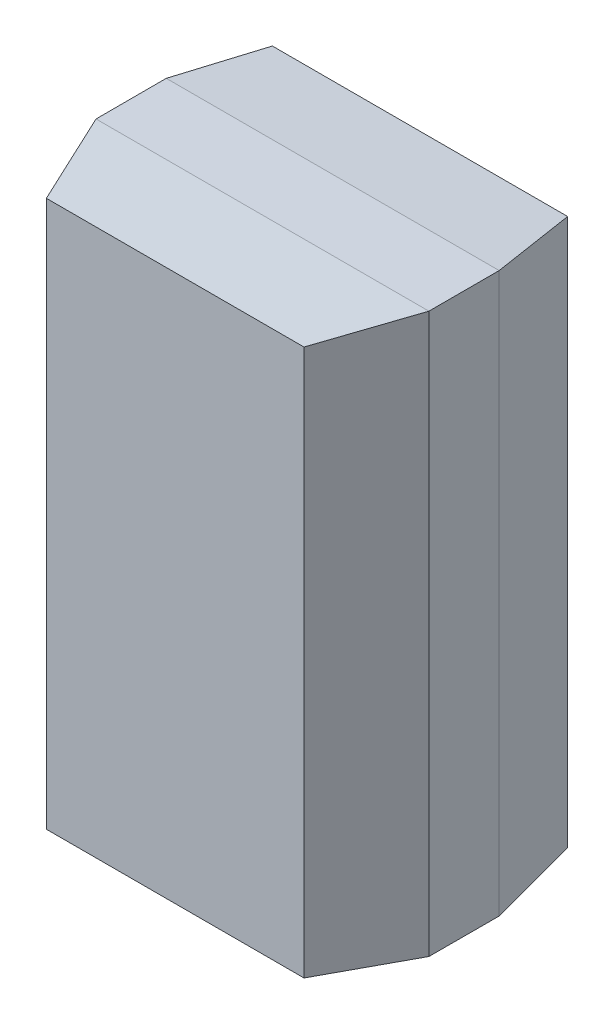
ISO-10303-21;
HEADER;
FILE_DESCRIPTION(('STEP AP214'),'2;1');
FILE_NAME('part.step','',(''),(''),'','','');
FILE_SCHEMA(('AUTOMOTIVE_DESIGN { 1 0 10303 214 1 1 1 1 }'));
ENDSEC;
DATA;
#1=APPLICATION_CONTEXT('core data for automotive mechanical design processes');
#2=APPLICATION_PROTOCOL_DEFINITION('international standard','automotive_design',2000,#1);
#3=PRODUCT_CONTEXT('',#1,'mechanical');
#4=PRODUCT('Part','Part','',(#3));
#5=PRODUCT_RELATED_PRODUCT_CATEGORY('part','',(#4));
#6=PRODUCT_DEFINITION_FORMATION('','',#4);
#7=PRODUCT_DEFINITION_CONTEXT('part definition',#1,'design');
#8=PRODUCT_DEFINITION('design','',#6,#7);
#9=PRODUCT_DEFINITION_SHAPE('','',#8);
#10=(LENGTH_UNIT() NAMED_UNIT(*) SI_UNIT(.MILLI.,.METRE.));
#11=(NAMED_UNIT(*) PLANE_ANGLE_UNIT() SI_UNIT($,.RADIAN.));
#12=(NAMED_UNIT(*) SI_UNIT($,.STERADIAN.) SOLID_ANGLE_UNIT());
#13=UNCERTAINTY_MEASURE_WITH_UNIT(LENGTH_MEASURE(1.E-05),#10,'distance_accuracy_value','');
#14=(GEOMETRIC_REPRESENTATION_CONTEXT(3) GLOBAL_UNCERTAINTY_ASSIGNED_CONTEXT((#13)) GLOBAL_UNIT_ASSIGNED_CONTEXT((#10,
#11,#12)) REPRESENTATION_CONTEXT('',''));
#15=CARTESIAN_POINT('',(0.,0.,0.));
#16=DIRECTION('',(0.,0.,1.));
#17=DIRECTION('',(1.,0.,0.));
#18=AXIS2_PLACEMENT_3D('',#15,#16,#17);
#19=CARTESIAN_POINT('',(-0.521,-1.105,1.092));
#20=DIRECTION('',(0.,0.,1.));
#21=DIRECTION('',(1.,0.,0.));
#22=AXIS2_PLACEMENT_3D('',#19,#20,#21);
#23=PLANE('',#22);
#24=CARTESIAN_POINT('',(-0.520884278768162,1.10451007763266,1.0919646194479));
#25=DIRECTION('',(1.,0.,0.));
#26=VECTOR('',#25,1.);
#27=LINE('',#24,#26);
#28=CARTESIAN_POINT('',(-0.520872850221572,1.10477993700184,1.09194067524361));
#29=VERTEX_POINT('',#28);
#30=CARTESIAN_POINT('',(0.520885144246092,1.10477688803578,1.09193434198205));
#31=VERTEX_POINT('',#30);
#32=EDGE_CURVE('E82',#29,#31,#27,.T.);
#33=ORIENTED_EDGE('',*,*,#32,.F.);
#34=CARTESIAN_POINT('',(-0.520768557536321,-1.105,1.09190016207449));
#35=DIRECTION('',(0.,1.,0.));
#36=VECTOR('',#35,1.);
#37=LINE('',#34,#36);
#38=CARTESIAN_POINT('',(-0.520885144246092,-1.10477688803578,1.09193434198205));
#39=VERTEX_POINT('',#38);
#40=EDGE_CURVE('E87',#39,#29,#37,.T.);
#41=ORIENTED_EDGE('',*,*,#40,.F.);
#42=CARTESIAN_POINT('',(0.521000000000002,-1.10451007763266,1.0919646194479));
#43=DIRECTION('',(-1.,0.,0.));
#44=VECTOR('',#43,1.);
#45=LINE('',#42,#44);
#46=CARTESIAN_POINT('',(0.520918337871393,-1.10475637222843,1.09194717921793));
#47=VERTEX_POINT('',#46);
#48=EDGE_CURVE('E163',#47,#39,#45,.T.);
#49=ORIENTED_EDGE('',*,*,#48,.F.);
#50=CARTESIAN_POINT('',(0.520768557536321,1.105,1.09190016207449));
#51=DIRECTION('',(0.,-1.,0.));
#52=VECTOR('',#51,1.);
#53=LINE('',#50,#52);
#54=EDGE_CURVE('E90',#31,#47,#53,.T.);
#55=ORIENTED_EDGE('',*,*,#54,.F.);
#56=EDGE_LOOP('',(#33,#41,#49,#55));
#57=FACE_BOUND('',#56,.T.);
#58=ADVANCED_FACE('F17',(#57),#23,.T.);
#59=CARTESIAN_POINT('',(0.673,1.13,0.739));
#60=DIRECTION('',(0.,0.997402533149582,0.0720290695955298));
#61=DIRECTION('',(0.,-0.0720290695955298,0.997402533149582));
#62=AXIS2_PLACEMENT_3D('',#59,#60,#61);
#63=PLANE('',#62);
#64=ORIENTED_EDGE('',*,*,#32,.T.);
#65=CARTESIAN_POINT('',(0.673,1.13,0.739));
#66=DIRECTION('',(-0.395255794918901,-0.0649103412084533,0.916274797310954));
#67=VECTOR('',#66,1.);
#68=LINE('',#65,#67);
#69=CARTESIAN_POINT('',(0.673,1.13,0.739));
#70=VERTEX_POINT('',#69);
#71=EDGE_CURVE('E95',#70,#31,#68,.T.);
#72=ORIENTED_EDGE('',*,*,#71,.F.);
#73=DIRECTION('',(1.,0.,0.));
#74=VECTOR('',#73,1.);
#75=CARTESIAN_POINT('',(0.673,1.13,0.739));
#76=LINE('',#75,#74);
#77=CARTESIAN_POINT('',(-0.673,1.13,0.739));
#78=VERTEX_POINT('',#77);
#79=EDGE_CURVE('E103',#78,#70,#76,.T.);
#80=ORIENTED_EDGE('',*,*,#79,.F.);
#81=CARTESIAN_POINT('',(-0.520768557536321,1.105,1.09190016207449));
#82=DIRECTION('',(-0.395255794918901,0.0649103412084533,-0.916274797310954));
#83=VECTOR('',#82,1.);
#84=LINE('',#81,#83);
#85=EDGE_CURVE('E99',#29,#78,#84,.T.);
#86=ORIENTED_EDGE('',*,*,#85,.F.);
#87=EDGE_LOOP('',(#64,#72,#80,#86));
#88=FACE_BOUND('',#87,.T.);
#89=ADVANCED_FACE('F101',(#88),#63,.T.);
#90=CARTESIAN_POINT('',(0.673,-1.13,0.739));
#91=DIRECTION('',(0.918211212871071,0.,0.39609111143503));
#92=DIRECTION('',(0.39609111143503,0.,-0.918211212871071));
#93=AXIS2_PLACEMENT_3D('',#90,#91,#92);
#94=PLANE('',#93);
#95=ORIENTED_EDGE('',*,*,#54,.T.);
#96=CARTESIAN_POINT('',(0.673000000000001,-1.13,0.739));
#97=DIRECTION('',(-0.394655110990625,0.0661824219804303,0.916442704368244));
#98=VECTOR('',#97,1.);
#99=LINE('',#96,#98);
#100=CARTESIAN_POINT('',(0.673,-1.13,0.739));
#101=VERTEX_POINT('',#100);
#102=EDGE_CURVE('E182',#101,#47,#99,.T.);
#103=ORIENTED_EDGE('',*,*,#102,.F.);
#104=DIRECTION('',(0.,1.,0.));
#105=VECTOR('',#104,1.);
#106=CARTESIAN_POINT('',(0.673,-1.13,0.739));
#107=LINE('',#106,#105);
#108=EDGE_CURVE('E258',#70,#101,#107,.F.);
#109=ORIENTED_EDGE('',*,*,#108,.F.);
#110=ORIENTED_EDGE('',*,*,#71,.T.);
#111=EDGE_LOOP('',(#95,#103,#109,#110));
#112=FACE_BOUND('',#111,.T.);
#113=ADVANCED_FACE('F199',(#112),#94,.T.);
#114=CARTESIAN_POINT('',(-0.673,-1.13,0.739));
#115=DIRECTION('',(0.,-0.997402533149582,0.0720290695955298));
#116=DIRECTION('',(0.,-0.0720290695955298,-0.997402533149582));
#117=AXIS2_PLACEMENT_3D('',#114,#115,#116);
#118=PLANE('',#117);
#119=ORIENTED_EDGE('',*,*,#48,.T.);
#120=CARTESIAN_POINT('',(-0.673,-1.13,0.739));
#121=DIRECTION('',(0.395255794918901,0.0649103412084533,0.916274797310954));
#122=VECTOR('',#121,1.);
#123=LINE('',#120,#122);
#124=CARTESIAN_POINT('',(-0.673,-1.13,0.739));
#125=VERTEX_POINT('',#124);
#126=EDGE_CURVE('E112',#125,#39,#123,.T.);
#127=ORIENTED_EDGE('',*,*,#126,.F.);
#128=DIRECTION('',(1.,0.,0.));
#129=VECTOR('',#128,1.);
#130=CARTESIAN_POINT('',(-0.673,-1.13,0.739));
#131=LINE('',#130,#129);
#132=EDGE_CURVE('E440',#101,#125,#131,.F.);
#133=ORIENTED_EDGE('',*,*,#132,.F.);
#134=ORIENTED_EDGE('',*,*,#102,.T.);
#135=EDGE_LOOP('',(#119,#127,#133,#134));
#136=FACE_BOUND('',#135,.T.);
#137=ADVANCED_FACE('F131',(#136),#118,.T.);
#138=CARTESIAN_POINT('',(-0.673,1.13,0.739));
#139=DIRECTION('',(-0.918211212871071,0.,0.39609111143503));
#140=DIRECTION('',(0.39609111143503,0.,0.918211212871071));
#141=AXIS2_PLACEMENT_3D('',#138,#139,#140);
#142=PLANE('',#141);
#143=ORIENTED_EDGE('',*,*,#40,.T.);
#144=ORIENTED_EDGE('',*,*,#85,.T.);
#145=DIRECTION('',(0.,1.,0.));
#146=VECTOR('',#145,1.);
#147=CARTESIAN_POINT('',(-0.673,1.13,0.739));
#148=LINE('',#147,#146);
#149=EDGE_CURVE('E429',#125,#78,#148,.T.);
#150=ORIENTED_EDGE('',*,*,#149,.F.);
#151=ORIENTED_EDGE('',*,*,#126,.T.);
#152=EDGE_LOOP('',(#143,#144,#150,#151));
#153=FACE_BOUND('',#152,.T.);
#154=ADVANCED_FACE('F111',(#153),#142,.T.);
#155=CARTESIAN_POINT('',(0.673,1.13,0.455));
#156=DIRECTION('',(0.,1.,0.));
#157=DIRECTION('',(0.,0.,1.));
#158=AXIS2_PLACEMENT_3D('',#155,#156,#157);
#159=PLANE('',#158);
#160=ORIENTED_EDGE('',*,*,#79,.T.);
#161=DIRECTION('',(0.,0.,-1.));
#162=VECTOR('',#161,1.);
#163=CARTESIAN_POINT('',(0.673,1.13,0.455));
#164=LINE('',#163,#162);
#165=CARTESIAN_POINT('',(0.673104280237953,1.13021992278882,0.45496159679707));
#166=VERTEX_POINT('',#165);
#167=EDGE_CURVE('E252',#166,#70,#164,.F.);
#168=ORIENTED_EDGE('',*,*,#167,.F.);
#169=CARTESIAN_POINT('',(-0.673112950803298,1.13048992236734,0.454964619447895));
#170=DIRECTION('',(1.,0.,0.));
#171=VECTOR('',#170,1.);
#172=LINE('',#169,#171);
#173=CARTESIAN_POINT('',(-0.673116299216848,1.13021595085409,0.454965373271963));
#174=VERTEX_POINT('',#173);
#175=EDGE_CURVE('E425',#174,#166,#172,.T.);
#176=ORIENTED_EDGE('',*,*,#175,.F.);
#177=DIRECTION('',(0.,0.,1.));
#178=VECTOR('',#177,1.);
#179=CARTESIAN_POINT('',(-0.673,1.13,0.455));
#180=LINE('',#179,#178);
#181=EDGE_CURVE('E255',#78,#174,#180,.F.);
#182=ORIENTED_EDGE('',*,*,#181,.F.);
#183=EDGE_LOOP('',(#160,#168,#176,#182));
#184=FACE_BOUND('',#183,.T.);
#185=ADVANCED_FACE('F130',(#184),#159,.T.);
#186=CARTESIAN_POINT('',(0.673,-1.13,0.455));
#187=DIRECTION('',(1.,0.,0.));
#188=DIRECTION('',(0.,0.,-1.));
#189=AXIS2_PLACEMENT_3D('',#186,#187,#188);
#190=PLANE('',#189);
#191=ORIENTED_EDGE('',*,*,#108,.T.);
#192=DIRECTION('',(0.,0.,-1.));
#193=VECTOR('',#192,1.);
#194=CARTESIAN_POINT('',(0.673,-1.13,0.455));
#195=LINE('',#194,#193);
#196=CARTESIAN_POINT('',(0.673071674143448,-1.13024079038525,0.454967131657619));
#197=VERTEX_POINT('',#196);
#198=EDGE_CURVE('E260',#197,#101,#195,.F.);
#199=ORIENTED_EDGE('',*,*,#198,.F.);
#200=CARTESIAN_POINT('',(0.673225901606595,1.13,0.454951212652005));
#201=DIRECTION('',(0.,-1.,0.));
#202=VECTOR('',#201,1.);
#203=LINE('',#200,#202);
#204=EDGE_CURVE('E265',#166,#197,#203,.T.);
#205=ORIENTED_EDGE('',*,*,#204,.F.);
#206=ORIENTED_EDGE('',*,*,#167,.T.);
#207=EDGE_LOOP('',(#191,#199,#205,#206));
#208=FACE_BOUND('',#207,.T.);
#209=ADVANCED_FACE('F263',(#208),#190,.T.);
#210=CARTESIAN_POINT('',(-0.673,-1.13,0.455));
#211=DIRECTION('',(0.,-1.,0.));
#212=DIRECTION('',(0.,0.,-1.));
#213=AXIS2_PLACEMENT_3D('',#210,#211,#212);
#214=PLANE('',#213);
#215=ORIENTED_EDGE('',*,*,#132,.T.);
#216=DIRECTION('',(0.,0.,1.));
#217=VECTOR('',#216,1.);
#218=CARTESIAN_POINT('',(-0.673,-1.13,0.455));
#219=LINE('',#218,#217);
#220=CARTESIAN_POINT('',(-0.673104280237953,-1.13021992278882,0.45496159679707));
#221=VERTEX_POINT('',#220);
#222=EDGE_CURVE('E432',#221,#125,#219,.T.);
#223=ORIENTED_EDGE('',*,*,#222,.F.);
#224=CARTESIAN_POINT('',(0.673000000000002,-1.13048992236734,0.454964619447895));
#225=DIRECTION('',(-1.,0.,0.));
#226=VECTOR('',#225,1.);
#227=LINE('',#224,#226);
#228=EDGE_CURVE('E378',#197,#221,#227,.T.);
#229=ORIENTED_EDGE('',*,*,#228,.F.);
#230=ORIENTED_EDGE('',*,*,#198,.T.);
#231=EDGE_LOOP('',(#215,#223,#229,#230));
#232=FACE_BOUND('',#231,.T.);
#233=ADVANCED_FACE('F395',(#232),#214,.T.);
#234=CARTESIAN_POINT('',(-0.673,1.13,0.455));
#235=DIRECTION('',(-1.,0.,0.));
#236=DIRECTION('',(0.,0.,1.));
#237=AXIS2_PLACEMENT_3D('',#234,#235,#236);
#238=PLANE('',#237);
#239=ORIENTED_EDGE('',*,*,#149,.T.);
#240=ORIENTED_EDGE('',*,*,#181,.T.);
#241=CARTESIAN_POINT('',(-0.673225901606595,-1.13,0.454951212652005));
#242=DIRECTION('',(0.,1.,0.));
#243=VECTOR('',#242,1.);
#244=LINE('',#241,#243);
#245=EDGE_CURVE('E330',#221,#174,#244,.T.);
#246=ORIENTED_EDGE('',*,*,#245,.F.);
#247=ORIENTED_EDGE('',*,*,#222,.T.);
#248=EDGE_LOOP('',(#239,#240,#246,#247));
#249=FACE_BOUND('',#248,.T.);
#250=ADVANCED_FACE('F403',(#249),#238,.T.);
#251=CARTESIAN_POINT('',(0.597,1.105,0.102));
#252=DIRECTION('',(0.,0.997402533149582,-0.0720290695955298));
#253=DIRECTION('',(0.,0.0720290695955298,0.997402533149582));
#254=AXIS2_PLACEMENT_3D('',#251,#252,#253);
#255=PLANE('',#254);
#256=ORIENTED_EDGE('',*,*,#175,.T.);
#257=CARTESIAN_POINT('',(0.597,1.105,0.102));
#258=DIRECTION('',(0.210596153760081,0.0690697483799457,0.975130057930834));
#259=VECTOR('',#258,1.);
#260=LINE('',#257,#259);
#261=CARTESIAN_POINT('',(0.597,1.105,0.102));
#262=VERTEX_POINT('',#261);
#263=EDGE_CURVE('E278',#262,#166,#260,.T.);
#264=ORIENTED_EDGE('',*,*,#263,.F.);
#265=DIRECTION('',(-1.,0.,0.));
#266=VECTOR('',#265,1.);
#267=CARTESIAN_POINT('',(-0.597,1.105,0.102));
#268=LINE('',#267,#266);
#269=CARTESIAN_POINT('',(-0.597,1.105,0.102));
#270=VERTEX_POINT('',#269);
#271=EDGE_CURVE('E321',#270,#262,#268,.F.);
#272=ORIENTED_EDGE('',*,*,#271,.F.);
#273=DIRECTION('',(0.210576314780502,-0.0704139921513365,-0.97503819687373));
#274=VECTOR('',#273,1.);
#275=CARTESIAN_POINT('',(-0.597,1.105,0.102));
#276=LINE('',#275,#274);
#277=EDGE_CURVE('E326',#174,#270,#276,.T.);
#278=ORIENTED_EDGE('',*,*,#277,.F.);
#279=EDGE_LOOP('',(#256,#264,#272,#278));
#280=FACE_BOUND('',#279,.T.);
#281=ADVANCED_FACE('F295',(#280),#255,.T.);
#282=CARTESIAN_POINT('',(0.597,-1.105,0.102));
#283=DIRECTION('',(0.977464405915382,0.,-0.211100296467082));
#284=DIRECTION('',(-0.211100296467082,0.,-0.977464405915382));
#285=AXIS2_PLACEMENT_3D('',#282,#283,#284);
#286=PLANE('',#285);
#287=ORIENTED_EDGE('',*,*,#204,.T.);
#288=CARTESIAN_POINT('',(0.597000000000001,-1.105,0.102));
#289=DIRECTION('',(0.209972185621706,-0.0704233514578709,0.975167797271159));
#290=VECTOR('',#289,1.);
#291=LINE('',#288,#290);
#292=CARTESIAN_POINT('',(0.597,-1.105,0.102));
#293=VERTEX_POINT('',#292);
#294=EDGE_CURVE('E414',#293,#197,#291,.T.);
#295=ORIENTED_EDGE('',*,*,#294,.F.);
#296=DIRECTION('',(0.,1.,0.));
#297=VECTOR('',#296,1.);
#298=CARTESIAN_POINT('',(0.597,1.105,0.102));
#299=LINE('',#298,#297);
#300=EDGE_CURVE('E319',#262,#293,#299,.F.);
#301=ORIENTED_EDGE('',*,*,#300,.F.);
#302=ORIENTED_EDGE('',*,*,#263,.T.);
#303=EDGE_LOOP('',(#287,#295,#301,#302));
#304=FACE_BOUND('',#303,.T.);
#305=ADVANCED_FACE('F284',(#304),#286,.T.);
#306=CARTESIAN_POINT('',(-0.597,-1.105,0.102));
#307=DIRECTION('',(0.,-0.997402533149582,-0.0720290695955298));
#308=DIRECTION('',(0.,0.0720290695955298,-0.997402533149582));
#309=AXIS2_PLACEMENT_3D('',#306,#307,#308);
#310=PLANE('',#309);
#311=ORIENTED_EDGE('',*,*,#228,.T.);
#312=CARTESIAN_POINT('',(-0.597,-1.105,0.102));
#313=DIRECTION('',(-0.210596153760081,-0.0690697483799457,0.975130057930834));
#314=VECTOR('',#313,1.);
#315=LINE('',#312,#314);
#316=CARTESIAN_POINT('',(-0.597,-1.105,0.102));
#317=VERTEX_POINT('',#316);
#318=EDGE_CURVE('E36',#317,#221,#315,.T.);
#319=ORIENTED_EDGE('',*,*,#318,.F.);
#320=DIRECTION('',(-1.,0.,0.));
#321=VECTOR('',#320,1.);
#322=CARTESIAN_POINT('',(-0.597,-1.105,0.102));
#323=LINE('',#322,#321);
#324=EDGE_CURVE('E27',#293,#317,#323,.T.);
#325=ORIENTED_EDGE('',*,*,#324,.F.);
#326=ORIENTED_EDGE('',*,*,#294,.T.);
#327=EDGE_LOOP('',(#311,#319,#325,#326));
#328=FACE_BOUND('',#327,.T.);
#329=ADVANCED_FACE('F294',(#328),#310,.T.);
#330=CARTESIAN_POINT('',(-0.597,1.105,0.102));
#331=DIRECTION('',(-0.977464405915382,0.,-0.211100296467082));
#332=DIRECTION('',(-0.211100296467082,0.,0.977464405915382));
#333=AXIS2_PLACEMENT_3D('',#330,#331,#332);
#334=PLANE('',#333);
#335=ORIENTED_EDGE('',*,*,#245,.T.);
#336=ORIENTED_EDGE('',*,*,#277,.T.);
#337=DIRECTION('',(0.,1.,0.));
#338=VECTOR('',#337,1.);
#339=CARTESIAN_POINT('',(-0.597,1.105,0.102));
#340=LINE('',#339,#338);
#341=EDGE_CURVE('E11',#317,#270,#340,.T.);
#342=ORIENTED_EDGE('',*,*,#341,.F.);
#343=ORIENTED_EDGE('',*,*,#318,.T.);
#344=EDGE_LOOP('',(#335,#336,#342,#343));
#345=FACE_BOUND('',#344,.T.);
#346=ADVANCED_FACE('F344',(#345),#334,.T.);
#347=CARTESIAN_POINT('',(-0.597,1.105,0.102));
#348=DIRECTION('',(0.,0.,-1.));
#349=DIRECTION('',(-1.,0.,0.));
#350=AXIS2_PLACEMENT_3D('',#347,#348,#349);
#351=PLANE('',#350);
#352=ORIENTED_EDGE('',*,*,#324,.T.);
#353=ORIENTED_EDGE('',*,*,#341,.T.);
#354=ORIENTED_EDGE('',*,*,#271,.T.);
#355=ORIENTED_EDGE('',*,*,#300,.T.);
#356=EDGE_LOOP('',(#352,#353,#354,#355));
#357=FACE_BOUND('',#356,.T.);
#358=ADVANCED_FACE('F353',(#357),#351,.T.);
#359=CLOSED_SHELL('',(#58,#89,#113,#137,#154,#185,#209,#233,#250,#281,#305,#329,#346,#358));
#360=MANIFOLD_SOLID_BREP('B1',#359);
#361=ADVANCED_BREP_SHAPE_REPRESENTATION('',(#18,#360),#14);
#362=SHAPE_DEFINITION_REPRESENTATION(#9,#361);
ENDSEC;
END-ISO-10303-21;
